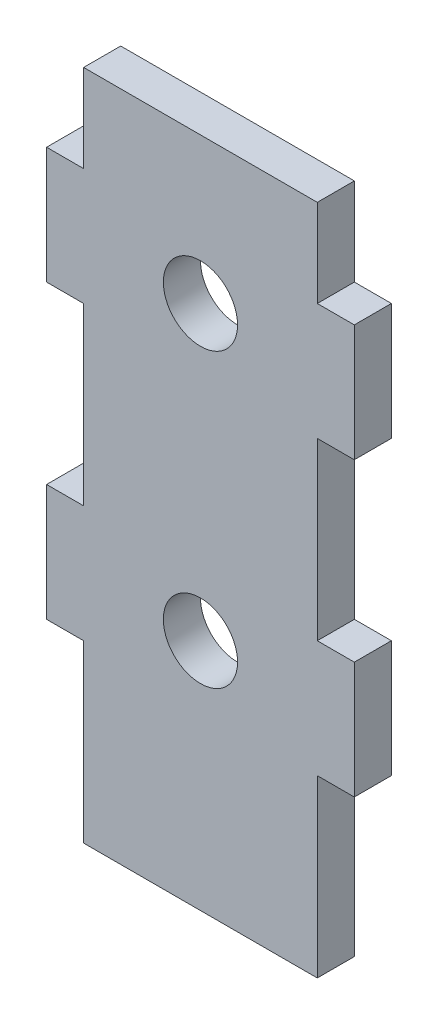
ISO-10303-21;
HEADER;
FILE_DESCRIPTION(('STEP AP214'),'2;1');
FILE_NAME('part.step','',(''),(''),'','','');
FILE_SCHEMA(('AUTOMOTIVE_DESIGN { 1 0 10303 214 1 1 1 1 }'));
ENDSEC;
DATA;
#1=APPLICATION_CONTEXT('core data for automotive mechanical design processes');
#2=APPLICATION_PROTOCOL_DEFINITION('international standard','automotive_design',2000,#1);
#3=PRODUCT_CONTEXT('',#1,'mechanical');
#4=PRODUCT('Part','Part','',(#3));
#5=PRODUCT_RELATED_PRODUCT_CATEGORY('part','',(#4));
#6=PRODUCT_DEFINITION_FORMATION('','',#4);
#7=PRODUCT_DEFINITION_CONTEXT('part definition',#1,'design');
#8=PRODUCT_DEFINITION('design','',#6,#7);
#9=PRODUCT_DEFINITION_SHAPE('','',#8);
#10=(LENGTH_UNIT() NAMED_UNIT(*) SI_UNIT(.MILLI.,.METRE.));
#11=(NAMED_UNIT(*) PLANE_ANGLE_UNIT() SI_UNIT($,.RADIAN.));
#12=(NAMED_UNIT(*) SI_UNIT($,.STERADIAN.) SOLID_ANGLE_UNIT());
#13=UNCERTAINTY_MEASURE_WITH_UNIT(LENGTH_MEASURE(1.E-05),#10,'distance_accuracy_value','');
#14=(GEOMETRIC_REPRESENTATION_CONTEXT(3) GLOBAL_UNCERTAINTY_ASSIGNED_CONTEXT((#13)) GLOBAL_UNIT_ASSIGNED_CONTEXT((#10,
#11,#12)) REPRESENTATION_CONTEXT('',''));
#15=CARTESIAN_POINT('',(0.,0.,0.));
#16=DIRECTION('',(0.,0.,1.));
#17=DIRECTION('',(1.,0.,0.));
#18=AXIS2_PLACEMENT_3D('',#15,#16,#17);
#19=CARTESIAN_POINT('',(20.,0.,6.35));
#20=DIRECTION('',(-1.,0.,0.));
#21=DIRECTION('',(0.,-1.,0.));
#22=AXIS2_PLACEMENT_3D('',#19,#20,#21);
#23=PLANE('',#22);
#24=DIRECTION('',(0.,1.,0.));
#25=VECTOR('',#24,1.);
#26=CARTESIAN_POINT('',(20.,0.,0.));
#27=LINE('',#26,#25);
#28=CARTESIAN_POINT('',(20.,0.,0.));
#29=VERTEX_POINT('',#28);
#30=CARTESIAN_POINT('',(20.,30.,0.));
#31=VERTEX_POINT('',#30);
#32=EDGE_CURVE('E214',#29,#31,#27,.T.);
#33=ORIENTED_EDGE('',*,*,#32,.T.);
#34=DIRECTION('',(0.,0.,-1.));
#35=VECTOR('',#34,1.);
#36=CARTESIAN_POINT('',(20.,30.,6.35));
#37=LINE('',#36,#35);
#38=CARTESIAN_POINT('',(20.,30.,6.35));
#39=VERTEX_POINT('',#38);
#40=EDGE_CURVE('E13',#39,#31,#37,.T.);
#41=ORIENTED_EDGE('',*,*,#40,.F.);
#42=DIRECTION('',(0.,1.,0.));
#43=VECTOR('',#42,1.);
#44=CARTESIAN_POINT('',(20.,0.,6.35));
#45=LINE('',#44,#43);
#46=CARTESIAN_POINT('',(20.,0.,6.35));
#47=VERTEX_POINT('',#46);
#48=EDGE_CURVE('E253',#47,#39,#45,.T.);
#49=ORIENTED_EDGE('',*,*,#48,.F.);
#50=DIRECTION('',(0.,0.,-1.));
#51=VECTOR('',#50,1.);
#52=CARTESIAN_POINT('',(20.,0.,6.35));
#53=LINE('',#52,#51);
#54=EDGE_CURVE('E210',#47,#29,#53,.T.);
#55=ORIENTED_EDGE('',*,*,#54,.T.);
#56=EDGE_LOOP('',(#33,#41,#49,#55));
#57=FACE_BOUND('',#56,.T.);
#58=ADVANCED_FACE('F46',(#57),#23,.F.);
#59=CARTESIAN_POINT('',(20.,30.,6.35));
#60=DIRECTION('',(0.,1.,0.));
#61=DIRECTION('',(-1.,0.,0.));
#62=AXIS2_PLACEMENT_3D('',#59,#60,#61);
#63=PLANE('',#62);
#64=DIRECTION('',(1.,0.,0.));
#65=VECTOR('',#64,1.);
#66=CARTESIAN_POINT('',(20.,30.,0.));
#67=LINE('',#66,#65);
#68=CARTESIAN_POINT('',(26.34,30.,0.));
#69=VERTEX_POINT('',#68);
#70=EDGE_CURVE('E217',#31,#69,#67,.T.);
#71=ORIENTED_EDGE('',*,*,#70,.T.);
#72=DIRECTION('',(0.,0.,-1.));
#73=VECTOR('',#72,1.);
#74=CARTESIAN_POINT('',(26.34,30.,6.35));
#75=LINE('',#74,#73);
#76=CARTESIAN_POINT('',(26.34,30.,6.35));
#77=VERTEX_POINT('',#76);
#78=EDGE_CURVE('E54',#77,#69,#75,.T.);
#79=ORIENTED_EDGE('',*,*,#78,.F.);
#80=DIRECTION('',(1.,0.,0.));
#81=VECTOR('',#80,1.);
#82=CARTESIAN_POINT('',(20.,30.,6.35));
#83=LINE('',#82,#81);
#84=EDGE_CURVE('E141',#39,#77,#83,.T.);
#85=ORIENTED_EDGE('',*,*,#84,.F.);
#86=ORIENTED_EDGE('',*,*,#40,.T.);
#87=EDGE_LOOP('',(#71,#79,#85,#86));
#88=FACE_BOUND('',#87,.T.);
#89=ADVANCED_FACE('F372',(#88),#63,.F.);
#90=CARTESIAN_POINT('',(26.34,30.,6.35));
#91=DIRECTION('',(-1.,0.,0.));
#92=DIRECTION('',(0.,0.,1.));
#93=AXIS2_PLACEMENT_3D('',#90,#91,#92);
#94=PLANE('',#93);
#95=DIRECTION('',(0.,1.,0.));
#96=VECTOR('',#95,1.);
#97=CARTESIAN_POINT('',(26.34,30.,0.));
#98=LINE('',#97,#96);
#99=CARTESIAN_POINT('',(26.34,50.,0.));
#100=VERTEX_POINT('',#99);
#101=EDGE_CURVE('E220',#69,#100,#98,.T.);
#102=ORIENTED_EDGE('',*,*,#101,.T.);
#103=DIRECTION('',(0.,0.,-1.));
#104=VECTOR('',#103,1.);
#105=CARTESIAN_POINT('',(26.34,50.,6.35));
#106=LINE('',#105,#104);
#107=CARTESIAN_POINT('',(26.34,50.,6.35));
#108=VERTEX_POINT('',#107);
#109=EDGE_CURVE('E296',#108,#100,#106,.T.);
#110=ORIENTED_EDGE('',*,*,#109,.F.);
#111=DIRECTION('',(0.,1.,0.));
#112=VECTOR('',#111,1.);
#113=CARTESIAN_POINT('',(26.34,30.,6.35));
#114=LINE('',#113,#112);
#115=EDGE_CURVE('E304',#77,#108,#114,.T.);
#116=ORIENTED_EDGE('',*,*,#115,.F.);
#117=ORIENTED_EDGE('',*,*,#78,.T.);
#118=EDGE_LOOP('',(#102,#110,#116,#117));
#119=FACE_BOUND('',#118,.T.);
#120=ADVANCED_FACE('F302',(#119),#94,.F.);
#121=CARTESIAN_POINT('',(26.34,50.,6.35));
#122=DIRECTION('',(0.,-1.,0.));
#123=DIRECTION('',(0.,0.,-1.));
#124=AXIS2_PLACEMENT_3D('',#121,#122,#123);
#125=PLANE('',#124);
#126=DIRECTION('',(-1.,0.,0.));
#127=VECTOR('',#126,1.);
#128=CARTESIAN_POINT('',(26.34,50.,0.));
#129=LINE('',#128,#127);
#130=CARTESIAN_POINT('',(20.,50.,0.));
#131=VERTEX_POINT('',#130);
#132=EDGE_CURVE('E222',#100,#131,#129,.T.);
#133=ORIENTED_EDGE('',*,*,#132,.T.);
#134=DIRECTION('',(0.,0.,-1.));
#135=VECTOR('',#134,1.);
#136=CARTESIAN_POINT('',(20.,50.,6.35));
#137=LINE('',#136,#135);
#138=CARTESIAN_POINT('',(20.,50.,6.35));
#139=VERTEX_POINT('',#138);
#140=EDGE_CURVE('E293',#139,#131,#137,.T.);
#141=ORIENTED_EDGE('',*,*,#140,.F.);
#142=DIRECTION('',(-1.,0.,0.));
#143=VECTOR('',#142,1.);
#144=CARTESIAN_POINT('',(26.34,50.,6.35));
#145=LINE('',#144,#143);
#146=EDGE_CURVE('E322',#108,#139,#145,.T.);
#147=ORIENTED_EDGE('',*,*,#146,.F.);
#148=ORIENTED_EDGE('',*,*,#109,.T.);
#149=EDGE_LOOP('',(#133,#141,#147,#148));
#150=FACE_BOUND('',#149,.T.);
#151=ADVANCED_FACE('F313',(#150),#125,.F.);
#152=CARTESIAN_POINT('',(20.,50.,6.35));
#153=DIRECTION('',(-1.,0.,0.));
#154=DIRECTION('',(0.,-1.,0.));
#155=AXIS2_PLACEMENT_3D('',#152,#153,#154);
#156=PLANE('',#155);
#157=DIRECTION('',(0.,1.,0.));
#158=VECTOR('',#157,1.);
#159=CARTESIAN_POINT('',(20.,50.,0.));
#160=LINE('',#159,#158);
#161=CARTESIAN_POINT('',(20.,80.,0.));
#162=VERTEX_POINT('',#161);
#163=EDGE_CURVE('E224',#131,#162,#160,.T.);
#164=ORIENTED_EDGE('',*,*,#163,.T.);
#165=DIRECTION('',(0.,0.,-1.));
#166=VECTOR('',#165,1.);
#167=CARTESIAN_POINT('',(20.,80.,6.35));
#168=LINE('',#167,#166);
#169=CARTESIAN_POINT('',(20.,80.,6.35));
#170=VERTEX_POINT('',#169);
#171=EDGE_CURVE('E290',#170,#162,#168,.T.);
#172=ORIENTED_EDGE('',*,*,#171,.F.);
#173=DIRECTION('',(0.,1.,0.));
#174=VECTOR('',#173,1.);
#175=CARTESIAN_POINT('',(20.,50.,6.35));
#176=LINE('',#175,#174);
#177=EDGE_CURVE('E319',#139,#170,#176,.T.);
#178=ORIENTED_EDGE('',*,*,#177,.F.);
#179=ORIENTED_EDGE('',*,*,#140,.T.);
#180=EDGE_LOOP('',(#164,#172,#178,#179));
#181=FACE_BOUND('',#180,.T.);
#182=ADVANCED_FACE('F317',(#181),#156,.F.);
#183=CARTESIAN_POINT('',(20.,80.,6.35));
#184=DIRECTION('',(0.,1.,0.));
#185=DIRECTION('',(0.,0.,1.));
#186=AXIS2_PLACEMENT_3D('',#183,#184,#185);
#187=PLANE('',#186);
#188=DIRECTION('',(1.,0.,0.));
#189=VECTOR('',#188,1.);
#190=CARTESIAN_POINT('',(20.,80.,0.));
#191=LINE('',#190,#189);
#192=CARTESIAN_POINT('',(26.34,80.,0.));
#193=VERTEX_POINT('',#192);
#194=EDGE_CURVE('E226',#162,#193,#191,.T.);
#195=ORIENTED_EDGE('',*,*,#194,.T.);
#196=DIRECTION('',(0.,0.,-1.));
#197=VECTOR('',#196,1.);
#198=CARTESIAN_POINT('',(26.34,80.,6.35));
#199=LINE('',#198,#197);
#200=CARTESIAN_POINT('',(26.34,80.,6.35));
#201=VERTEX_POINT('',#200);
#202=EDGE_CURVE('E287',#201,#193,#199,.T.);
#203=ORIENTED_EDGE('',*,*,#202,.F.);
#204=DIRECTION('',(1.,0.,0.));
#205=VECTOR('',#204,1.);
#206=CARTESIAN_POINT('',(20.,80.,6.35));
#207=LINE('',#206,#205);
#208=EDGE_CURVE('E321',#170,#201,#207,.T.);
#209=ORIENTED_EDGE('',*,*,#208,.F.);
#210=ORIENTED_EDGE('',*,*,#171,.T.);
#211=EDGE_LOOP('',(#195,#203,#209,#210));
#212=FACE_BOUND('',#211,.T.);
#213=ADVANCED_FACE('F385',(#212),#187,.F.);
#214=CARTESIAN_POINT('',(26.34,80.,6.35));
#215=DIRECTION('',(-1.,0.,0.));
#216=DIRECTION('',(0.,-1.,0.));
#217=AXIS2_PLACEMENT_3D('',#214,#215,#216);
#218=PLANE('',#217);
#219=DIRECTION('',(0.,1.,0.));
#220=VECTOR('',#219,1.);
#221=CARTESIAN_POINT('',(26.34,80.,0.));
#222=LINE('',#221,#220);
#223=CARTESIAN_POINT('',(26.34,100.,0.));
#224=VERTEX_POINT('',#223);
#225=EDGE_CURVE('E228',#193,#224,#222,.T.);
#226=ORIENTED_EDGE('',*,*,#225,.T.);
#227=DIRECTION('',(0.,0.,-1.));
#228=VECTOR('',#227,1.);
#229=CARTESIAN_POINT('',(26.34,100.,6.35));
#230=LINE('',#229,#228);
#231=CARTESIAN_POINT('',(26.34,100.,6.35));
#232=VERTEX_POINT('',#231);
#233=EDGE_CURVE('E284',#232,#224,#230,.T.);
#234=ORIENTED_EDGE('',*,*,#233,.F.);
#235=DIRECTION('',(0.,1.,0.));
#236=VECTOR('',#235,1.);
#237=CARTESIAN_POINT('',(26.34,80.,6.35));
#238=LINE('',#237,#236);
#239=EDGE_CURVE('E324',#201,#232,#238,.T.);
#240=ORIENTED_EDGE('',*,*,#239,.F.);
#241=ORIENTED_EDGE('',*,*,#202,.T.);
#242=EDGE_LOOP('',(#226,#234,#240,#241));
#243=FACE_BOUND('',#242,.T.);
#244=ADVANCED_FACE('F388',(#243),#218,.F.);
#245=CARTESIAN_POINT('',(26.34,100.,6.35));
#246=DIRECTION('',(0.,-1.,0.));
#247=DIRECTION('',(0.,0.,-1.));
#248=AXIS2_PLACEMENT_3D('',#245,#246,#247);
#249=PLANE('',#248);
#250=DIRECTION('',(-1.,0.,0.));
#251=VECTOR('',#250,1.);
#252=CARTESIAN_POINT('',(26.34,100.,0.));
#253=LINE('',#252,#251);
#254=CARTESIAN_POINT('',(20.,100.,0.));
#255=VERTEX_POINT('',#254);
#256=EDGE_CURVE('E230',#224,#255,#253,.T.);
#257=ORIENTED_EDGE('',*,*,#256,.T.);
#258=DIRECTION('',(0.,0.,-1.));
#259=VECTOR('',#258,1.);
#260=CARTESIAN_POINT('',(20.,100.,6.35));
#261=LINE('',#260,#259);
#262=CARTESIAN_POINT('',(20.,100.,6.35));
#263=VERTEX_POINT('',#262);
#264=EDGE_CURVE('E281',#263,#255,#261,.T.);
#265=ORIENTED_EDGE('',*,*,#264,.F.);
#266=DIRECTION('',(-1.,0.,0.));
#267=VECTOR('',#266,1.);
#268=CARTESIAN_POINT('',(26.34,100.,6.35));
#269=LINE('',#268,#267);
#270=EDGE_CURVE('E330',#232,#263,#269,.T.);
#271=ORIENTED_EDGE('',*,*,#270,.F.);
#272=ORIENTED_EDGE('',*,*,#233,.T.);
#273=EDGE_LOOP('',(#257,#265,#271,#272));
#274=FACE_BOUND('',#273,.T.);
#275=ADVANCED_FACE('F392',(#274),#249,.F.);
#276=CARTESIAN_POINT('',(20.,100.,6.35));
#277=DIRECTION('',(-1.,0.,0.));
#278=DIRECTION('',(0.,-1.,0.));
#279=AXIS2_PLACEMENT_3D('',#276,#277,#278);
#280=PLANE('',#279);
#281=DIRECTION('',(0.,1.,0.));
#282=VECTOR('',#281,1.);
#283=CARTESIAN_POINT('',(20.,100.,0.));
#284=LINE('',#283,#282);
#285=CARTESIAN_POINT('',(20.,115.,0.));
#286=VERTEX_POINT('',#285);
#287=EDGE_CURVE('E232',#255,#286,#284,.T.);
#288=ORIENTED_EDGE('',*,*,#287,.T.);
#289=DIRECTION('',(0.,0.,-1.));
#290=VECTOR('',#289,1.);
#291=CARTESIAN_POINT('',(20.,115.,6.35));
#292=LINE('',#291,#290);
#293=CARTESIAN_POINT('',(20.,115.,6.35));
#294=VERTEX_POINT('',#293);
#295=EDGE_CURVE('E278',#294,#286,#292,.T.);
#296=ORIENTED_EDGE('',*,*,#295,.F.);
#297=DIRECTION('',(0.,1.,0.));
#298=VECTOR('',#297,1.);
#299=CARTESIAN_POINT('',(20.,100.,6.35));
#300=LINE('',#299,#298);
#301=EDGE_CURVE('E332',#263,#294,#300,.T.);
#302=ORIENTED_EDGE('',*,*,#301,.F.);
#303=ORIENTED_EDGE('',*,*,#264,.T.);
#304=EDGE_LOOP('',(#288,#296,#302,#303));
#305=FACE_BOUND('',#304,.T.);
#306=ADVANCED_FACE('F396',(#305),#280,.F.);
#307=CARTESIAN_POINT('',(20.,115.,6.35));
#308=DIRECTION('',(0.,-1.,0.));
#309=DIRECTION('',(0.,0.,-1.));
#310=AXIS2_PLACEMENT_3D('',#307,#308,#309);
#311=PLANE('',#310);
#312=DIRECTION('',(-1.,0.,0.));
#313=VECTOR('',#312,1.);
#314=CARTESIAN_POINT('',(20.,115.,0.));
#315=LINE('',#314,#313);
#316=CARTESIAN_POINT('',(-20.,115.,0.));
#317=VERTEX_POINT('',#316);
#318=EDGE_CURVE('E234',#286,#317,#315,.T.);
#319=ORIENTED_EDGE('',*,*,#318,.T.);
#320=DIRECTION('',(0.,0.,-1.));
#321=VECTOR('',#320,1.);
#322=CARTESIAN_POINT('',(-20.,115.,6.35));
#323=LINE('',#322,#321);
#324=CARTESIAN_POINT('',(-20.,115.,6.35));
#325=VERTEX_POINT('',#324);
#326=EDGE_CURVE('E275',#325,#317,#323,.T.);
#327=ORIENTED_EDGE('',*,*,#326,.F.);
#328=DIRECTION('',(-1.,0.,0.));
#329=VECTOR('',#328,1.);
#330=CARTESIAN_POINT('',(20.,115.,6.35));
#331=LINE('',#330,#329);
#332=EDGE_CURVE('E334',#294,#325,#331,.T.);
#333=ORIENTED_EDGE('',*,*,#332,.F.);
#334=ORIENTED_EDGE('',*,*,#295,.T.);
#335=EDGE_LOOP('',(#319,#327,#333,#334));
#336=FACE_BOUND('',#335,.T.);
#337=ADVANCED_FACE('F400',(#336),#311,.F.);
#338=CARTESIAN_POINT('',(-20.,100.,6.35));
#339=DIRECTION('',(1.,0.,0.));
#340=DIRECTION('',(0.,1.,0.));
#341=AXIS2_PLACEMENT_3D('',#338,#339,#340);
#342=PLANE('',#341);
#343=DIRECTION('',(0.,-1.,0.));
#344=VECTOR('',#343,1.);
#345=CARTESIAN_POINT('',(-20.,100.,0.));
#346=LINE('',#345,#344);
#347=CARTESIAN_POINT('',(-20.,100.,0.));
#348=VERTEX_POINT('',#347);
#349=EDGE_CURVE('E236',#317,#348,#346,.T.);
#350=ORIENTED_EDGE('',*,*,#349,.T.);
#351=DIRECTION('',(0.,0.,-1.));
#352=VECTOR('',#351,1.);
#353=CARTESIAN_POINT('',(-20.,100.,6.35));
#354=LINE('',#353,#352);
#355=CARTESIAN_POINT('',(-20.,100.,6.35));
#356=VERTEX_POINT('',#355);
#357=EDGE_CURVE('E272',#356,#348,#354,.T.);
#358=ORIENTED_EDGE('',*,*,#357,.F.);
#359=DIRECTION('',(0.,-1.,0.));
#360=VECTOR('',#359,1.);
#361=CARTESIAN_POINT('',(-20.,100.,6.35));
#362=LINE('',#361,#360);
#363=EDGE_CURVE('E336',#325,#356,#362,.T.);
#364=ORIENTED_EDGE('',*,*,#363,.F.);
#365=ORIENTED_EDGE('',*,*,#326,.T.);
#366=EDGE_LOOP('',(#350,#358,#364,#365));
#367=FACE_BOUND('',#366,.T.);
#368=ADVANCED_FACE('F404',(#367),#342,.F.);
#369=CARTESIAN_POINT('',(-26.34,100.,6.35));
#370=DIRECTION('',(0.,-1.,0.));
#371=DIRECTION('',(0.,0.,-1.));
#372=AXIS2_PLACEMENT_3D('',#369,#370,#371);
#373=PLANE('',#372);
#374=DIRECTION('',(-1.,0.,0.));
#375=VECTOR('',#374,1.);
#376=CARTESIAN_POINT('',(-26.34,100.,0.));
#377=LINE('',#376,#375);
#378=CARTESIAN_POINT('',(-26.34,100.,0.));
#379=VERTEX_POINT('',#378);
#380=EDGE_CURVE('E238',#348,#379,#377,.T.);
#381=ORIENTED_EDGE('',*,*,#380,.T.);
#382=DIRECTION('',(0.,0.,-1.));
#383=VECTOR('',#382,1.);
#384=CARTESIAN_POINT('',(-26.34,100.,6.35));
#385=LINE('',#384,#383);
#386=CARTESIAN_POINT('',(-26.34,100.,6.35));
#387=VERTEX_POINT('',#386);
#388=EDGE_CURVE('E269',#387,#379,#385,.T.);
#389=ORIENTED_EDGE('',*,*,#388,.F.);
#390=DIRECTION('',(-1.,0.,0.));
#391=VECTOR('',#390,1.);
#392=CARTESIAN_POINT('',(-26.34,100.,6.35));
#393=LINE('',#392,#391);
#394=EDGE_CURVE('E338',#356,#387,#393,.T.);
#395=ORIENTED_EDGE('',*,*,#394,.F.);
#396=ORIENTED_EDGE('',*,*,#357,.T.);
#397=EDGE_LOOP('',(#381,#389,#395,#396));
#398=FACE_BOUND('',#397,.T.);
#399=ADVANCED_FACE('F408',(#398),#373,.F.);
#400=CARTESIAN_POINT('',(-26.34,80.,6.35));
#401=DIRECTION('',(1.,0.,0.));
#402=DIRECTION('',(0.,1.,0.));
#403=AXIS2_PLACEMENT_3D('',#400,#401,#402);
#404=PLANE('',#403);
#405=DIRECTION('',(0.,-1.,0.));
#406=VECTOR('',#405,1.);
#407=CARTESIAN_POINT('',(-26.34,80.,0.));
#408=LINE('',#407,#406);
#409=CARTESIAN_POINT('',(-26.34,80.,0.));
#410=VERTEX_POINT('',#409);
#411=EDGE_CURVE('E240',#379,#410,#408,.T.);
#412=ORIENTED_EDGE('',*,*,#411,.T.);
#413=DIRECTION('',(0.,0.,-1.));
#414=VECTOR('',#413,1.);
#415=CARTESIAN_POINT('',(-26.34,80.,6.35));
#416=LINE('',#415,#414);
#417=CARTESIAN_POINT('',(-26.34,80.,6.35));
#418=VERTEX_POINT('',#417);
#419=EDGE_CURVE('E266',#418,#410,#416,.T.);
#420=ORIENTED_EDGE('',*,*,#419,.F.);
#421=DIRECTION('',(0.,-1.,0.));
#422=VECTOR('',#421,1.);
#423=CARTESIAN_POINT('',(-26.34,80.,6.35));
#424=LINE('',#423,#422);
#425=EDGE_CURVE('E340',#387,#418,#424,.T.);
#426=ORIENTED_EDGE('',*,*,#425,.F.);
#427=ORIENTED_EDGE('',*,*,#388,.T.);
#428=EDGE_LOOP('',(#412,#420,#426,#427));
#429=FACE_BOUND('',#428,.T.);
#430=ADVANCED_FACE('F412',(#429),#404,.F.);
#431=CARTESIAN_POINT('',(-20.,80.,6.35));
#432=DIRECTION('',(0.,1.,0.));
#433=DIRECTION('',(0.,0.,1.));
#434=AXIS2_PLACEMENT_3D('',#431,#432,#433);
#435=PLANE('',#434);
#436=DIRECTION('',(1.,0.,0.));
#437=VECTOR('',#436,1.);
#438=CARTESIAN_POINT('',(-20.,80.,0.));
#439=LINE('',#438,#437);
#440=CARTESIAN_POINT('',(-20.,80.,0.));
#441=VERTEX_POINT('',#440);
#442=EDGE_CURVE('E242',#410,#441,#439,.T.);
#443=ORIENTED_EDGE('',*,*,#442,.T.);
#444=DIRECTION('',(0.,0.,-1.));
#445=VECTOR('',#444,1.);
#446=CARTESIAN_POINT('',(-20.,80.,6.35));
#447=LINE('',#446,#445);
#448=CARTESIAN_POINT('',(-20.,80.,6.35));
#449=VERTEX_POINT('',#448);
#450=EDGE_CURVE('E263',#449,#441,#447,.T.);
#451=ORIENTED_EDGE('',*,*,#450,.F.);
#452=DIRECTION('',(1.,0.,0.));
#453=VECTOR('',#452,1.);
#454=CARTESIAN_POINT('',(-20.,80.,6.35));
#455=LINE('',#454,#453);
#456=EDGE_CURVE('E342',#418,#449,#455,.T.);
#457=ORIENTED_EDGE('',*,*,#456,.F.);
#458=ORIENTED_EDGE('',*,*,#419,.T.);
#459=EDGE_LOOP('',(#443,#451,#457,#458));
#460=FACE_BOUND('',#459,.T.);
#461=ADVANCED_FACE('F416',(#460),#435,.F.);
#462=CARTESIAN_POINT('',(-20.,50.,6.35));
#463=DIRECTION('',(1.,0.,0.));
#464=DIRECTION('',(0.,0.,-1.));
#465=AXIS2_PLACEMENT_3D('',#462,#463,#464);
#466=PLANE('',#465);
#467=DIRECTION('',(0.,-1.,0.));
#468=VECTOR('',#467,1.);
#469=CARTESIAN_POINT('',(-20.,50.,0.));
#470=LINE('',#469,#468);
#471=CARTESIAN_POINT('',(-20.,50.,0.));
#472=VERTEX_POINT('',#471);
#473=EDGE_CURVE('E244',#441,#472,#470,.T.);
#474=ORIENTED_EDGE('',*,*,#473,.T.);
#475=DIRECTION('',(0.,0.,-1.));
#476=VECTOR('',#475,1.);
#477=CARTESIAN_POINT('',(-20.,50.,6.35));
#478=LINE('',#477,#476);
#479=CARTESIAN_POINT('',(-20.,50.,6.35));
#480=VERTEX_POINT('',#479);
#481=EDGE_CURVE('E260',#480,#472,#478,.T.);
#482=ORIENTED_EDGE('',*,*,#481,.F.);
#483=DIRECTION('',(0.,-1.,0.));
#484=VECTOR('',#483,1.);
#485=CARTESIAN_POINT('',(-20.,50.,6.35));
#486=LINE('',#485,#484);
#487=EDGE_CURVE('E344',#449,#480,#486,.T.);
#488=ORIENTED_EDGE('',*,*,#487,.F.);
#489=ORIENTED_EDGE('',*,*,#450,.T.);
#490=EDGE_LOOP('',(#474,#482,#488,#489));
#491=FACE_BOUND('',#490,.T.);
#492=ADVANCED_FACE('F420',(#491),#466,.F.);
#493=CARTESIAN_POINT('',(-26.34,50.,6.35));
#494=DIRECTION('',(0.,-1.,0.));
#495=DIRECTION('',(0.,0.,-1.));
#496=AXIS2_PLACEMENT_3D('',#493,#494,#495);
#497=PLANE('',#496);
#498=DIRECTION('',(-1.,0.,0.));
#499=VECTOR('',#498,1.);
#500=CARTESIAN_POINT('',(-26.34,50.,0.));
#501=LINE('',#500,#499);
#502=CARTESIAN_POINT('',(-26.34,50.,0.));
#503=VERTEX_POINT('',#502);
#504=EDGE_CURVE('E246',#472,#503,#501,.T.);
#505=ORIENTED_EDGE('',*,*,#504,.T.);
#506=DIRECTION('',(0.,0.,-1.));
#507=VECTOR('',#506,1.);
#508=CARTESIAN_POINT('',(-26.34,50.,6.35));
#509=LINE('',#508,#507);
#510=CARTESIAN_POINT('',(-26.34,50.,6.35));
#511=VERTEX_POINT('',#510);
#512=EDGE_CURVE('E257',#511,#503,#509,.T.);
#513=ORIENTED_EDGE('',*,*,#512,.F.);
#514=DIRECTION('',(-1.,0.,0.));
#515=VECTOR('',#514,1.);
#516=CARTESIAN_POINT('',(-26.34,50.,6.35));
#517=LINE('',#516,#515);
#518=EDGE_CURVE('E346',#480,#511,#517,.T.);
#519=ORIENTED_EDGE('',*,*,#518,.F.);
#520=ORIENTED_EDGE('',*,*,#481,.T.);
#521=EDGE_LOOP('',(#505,#513,#519,#520));
#522=FACE_BOUND('',#521,.T.);
#523=ADVANCED_FACE('F352',(#522),#497,.F.);
#524=CARTESIAN_POINT('',(-26.34,30.,6.35));
#525=DIRECTION('',(1.,0.,0.));
#526=DIRECTION('',(0.,1.,0.));
#527=AXIS2_PLACEMENT_3D('',#524,#525,#526);
#528=PLANE('',#527);
#529=DIRECTION('',(0.,-1.,0.));
#530=VECTOR('',#529,1.);
#531=CARTESIAN_POINT('',(-26.34,30.,0.));
#532=LINE('',#531,#530);
#533=CARTESIAN_POINT('',(-26.34,30.,0.));
#534=VERTEX_POINT('',#533);
#535=EDGE_CURVE('E248',#503,#534,#532,.T.);
#536=ORIENTED_EDGE('',*,*,#535,.T.);
#537=DIRECTION('',(0.,0.,-1.));
#538=VECTOR('',#537,1.);
#539=CARTESIAN_POINT('',(-26.34,30.,6.35));
#540=LINE('',#539,#538);
#541=CARTESIAN_POINT('',(-26.34,30.,6.35));
#542=VERTEX_POINT('',#541);
#543=EDGE_CURVE('E205',#542,#534,#540,.T.);
#544=ORIENTED_EDGE('',*,*,#543,.F.);
#545=DIRECTION('',(0.,-1.,0.));
#546=VECTOR('',#545,1.);
#547=CARTESIAN_POINT('',(-26.34,30.,6.35));
#548=LINE('',#547,#546);
#549=EDGE_CURVE('E196',#511,#542,#548,.T.);
#550=ORIENTED_EDGE('',*,*,#549,.F.);
#551=ORIENTED_EDGE('',*,*,#512,.T.);
#552=EDGE_LOOP('',(#536,#544,#550,#551));
#553=FACE_BOUND('',#552,.T.);
#554=ADVANCED_FACE('F356',(#553),#528,.F.);
#555=CARTESIAN_POINT('',(-20.,30.,6.35));
#556=DIRECTION('',(0.,1.,0.));
#557=DIRECTION('',(-1.,0.,0.));
#558=AXIS2_PLACEMENT_3D('',#555,#556,#557);
#559=PLANE('',#558);
#560=DIRECTION('',(1.,0.,0.));
#561=VECTOR('',#560,1.);
#562=CARTESIAN_POINT('',(-20.,30.,0.));
#563=LINE('',#562,#561);
#564=CARTESIAN_POINT('',(-20.,30.,0.));
#565=VERTEX_POINT('',#564);
#566=EDGE_CURVE('E204',#534,#565,#563,.T.);
#567=ORIENTED_EDGE('',*,*,#566,.T.);
#568=DIRECTION('',(0.,0.,-1.));
#569=VECTOR('',#568,1.);
#570=CARTESIAN_POINT('',(-20.,30.,6.35));
#571=LINE('',#570,#569);
#572=CARTESIAN_POINT('',(-20.,30.,6.35));
#573=VERTEX_POINT('',#572);
#574=EDGE_CURVE('E201',#573,#565,#571,.T.);
#575=ORIENTED_EDGE('',*,*,#574,.F.);
#576=DIRECTION('',(1.,0.,0.));
#577=VECTOR('',#576,1.);
#578=CARTESIAN_POINT('',(-20.,30.,6.35));
#579=LINE('',#578,#577);
#580=EDGE_CURVE('E190',#542,#573,#579,.T.);
#581=ORIENTED_EDGE('',*,*,#580,.F.);
#582=ORIENTED_EDGE('',*,*,#543,.T.);
#583=EDGE_LOOP('',(#567,#575,#581,#582));
#584=FACE_BOUND('',#583,.T.);
#585=ADVANCED_FACE('F202',(#584),#559,.F.);
#586=CARTESIAN_POINT('',(-20.,0.,6.35));
#587=DIRECTION('',(1.,0.,0.));
#588=DIRECTION('',(0.,1.,0.));
#589=AXIS2_PLACEMENT_3D('',#586,#587,#588);
#590=PLANE('',#589);
#591=DIRECTION('',(0.,-1.,0.));
#592=VECTOR('',#591,1.);
#593=CARTESIAN_POINT('',(-20.,0.,0.));
#594=LINE('',#593,#592);
#595=CARTESIAN_POINT('',(-20.,0.,0.));
#596=VERTEX_POINT('',#595);
#597=EDGE_CURVE('E127',#565,#596,#594,.T.);
#598=ORIENTED_EDGE('',*,*,#597,.T.);
#599=DIRECTION('',(0.,0.,-1.));
#600=VECTOR('',#599,1.);
#601=CARTESIAN_POINT('',(-20.,0.,6.35));
#602=LINE('',#601,#600);
#603=CARTESIAN_POINT('',(-20.,0.,6.35));
#604=VERTEX_POINT('',#603);
#605=EDGE_CURVE('E206',#604,#596,#602,.T.);
#606=ORIENTED_EDGE('',*,*,#605,.F.);
#607=DIRECTION('',(0.,-1.,0.));
#608=VECTOR('',#607,1.);
#609=CARTESIAN_POINT('',(-20.,0.,6.35));
#610=LINE('',#609,#608);
#611=EDGE_CURVE('E194',#573,#604,#610,.T.);
#612=ORIENTED_EDGE('',*,*,#611,.F.);
#613=ORIENTED_EDGE('',*,*,#574,.T.);
#614=EDGE_LOOP('',(#598,#606,#612,#613));
#615=FACE_BOUND('',#614,.T.);
#616=ADVANCED_FACE('F208',(#615),#590,.F.);
#617=CARTESIAN_POINT('',(-20.,0.,6.35));
#618=DIRECTION('',(0.,1.,0.));
#619=DIRECTION('',(0.,0.,1.));
#620=AXIS2_PLACEMENT_3D('',#617,#618,#619);
#621=PLANE('',#620);
#622=DIRECTION('',(1.,0.,0.));
#623=VECTOR('',#622,1.);
#624=CARTESIAN_POINT('',(-20.,0.,0.));
#625=LINE('',#624,#623);
#626=EDGE_CURVE('E133',#596,#29,#625,.T.);
#627=ORIENTED_EDGE('',*,*,#626,.T.);
#628=ORIENTED_EDGE('',*,*,#54,.F.);
#629=DIRECTION('',(1.,0.,0.));
#630=VECTOR('',#629,1.);
#631=CARTESIAN_POINT('',(-20.,0.,6.35));
#632=LINE('',#631,#630);
#633=EDGE_CURVE('E62',#604,#47,#632,.T.);
#634=ORIENTED_EDGE('',*,*,#633,.F.);
#635=ORIENTED_EDGE('',*,*,#605,.T.);
#636=EDGE_LOOP('',(#627,#628,#634,#635));
#637=FACE_BOUND('',#636,.T.);
#638=ADVANCED_FACE('F360',(#637),#621,.F.);
#639=CARTESIAN_POINT('',(0.,0.,6.35));
#640=DIRECTION('',(0.,0.,-1.));
#641=DIRECTION('',(-1.,0.,0.));
#642=AXIS2_PLACEMENT_3D('',#639,#640,#641);
#643=PLANE('',#642);
#644=CARTESIAN_POINT('',(0.,90.,6.35));
#645=DIRECTION('',(0.,0.,-1.));
#646=DIRECTION('',(-1.,0.,0.));
#647=AXIS2_PLACEMENT_3D('',#644,#645,#646);
#648=CIRCLE('',#647,6.34999999999999);
#649=CARTESIAN_POINT('',(-6.35,90.,6.35));
#650=VERTEX_POINT('',#649);
#651=EDGE_CURVE('E218',#650,#650,#648,.T.);
#652=ORIENTED_EDGE('',*,*,#651,.T.);
#653=EDGE_LOOP('',(#652));
#654=FACE_BOUND('',#653,.T.);
#655=CARTESIAN_POINT('',(0.,40.,6.35));
#656=DIRECTION('',(0.,0.,-1.));
#657=DIRECTION('',(-1.,0.,0.));
#658=AXIS2_PLACEMENT_3D('',#655,#656,#657);
#659=CIRCLE('',#658,6.35);
#660=CARTESIAN_POINT('',(-6.35000000000001,40.,6.35));
#661=VERTEX_POINT('',#660);
#662=EDGE_CURVE('E486',#661,#661,#659,.T.);
#663=ORIENTED_EDGE('',*,*,#662,.T.);
#664=EDGE_LOOP('',(#663));
#665=FACE_BOUND('',#664,.T.);
#666=ORIENTED_EDGE('',*,*,#48,.T.);
#667=ORIENTED_EDGE('',*,*,#84,.T.);
#668=ORIENTED_EDGE('',*,*,#115,.T.);
#669=ORIENTED_EDGE('',*,*,#146,.T.);
#670=ORIENTED_EDGE('',*,*,#177,.T.);
#671=ORIENTED_EDGE('',*,*,#208,.T.);
#672=ORIENTED_EDGE('',*,*,#239,.T.);
#673=ORIENTED_EDGE('',*,*,#270,.T.);
#674=ORIENTED_EDGE('',*,*,#301,.T.);
#675=ORIENTED_EDGE('',*,*,#332,.T.);
#676=ORIENTED_EDGE('',*,*,#363,.T.);
#677=ORIENTED_EDGE('',*,*,#394,.T.);
#678=ORIENTED_EDGE('',*,*,#425,.T.);
#679=ORIENTED_EDGE('',*,*,#456,.T.);
#680=ORIENTED_EDGE('',*,*,#487,.T.);
#681=ORIENTED_EDGE('',*,*,#518,.T.);
#682=ORIENTED_EDGE('',*,*,#549,.T.);
#683=ORIENTED_EDGE('',*,*,#580,.T.);
#684=ORIENTED_EDGE('',*,*,#611,.T.);
#685=ORIENTED_EDGE('',*,*,#633,.T.);
#686=EDGE_LOOP('',(#666,#667,#668,#669,#670,#671,#672,#673,#674,#675,#676,#677,#678,#679,#680,
#681,#682,#683,#684,#685));
#687=FACE_BOUND('',#686,.T.);
#688=ADVANCED_FACE('F192',(#654,#665,#687),#643,.F.);
#689=CARTESIAN_POINT('',(0.,0.,0.));
#690=DIRECTION('',(0.,0.,-1.));
#691=DIRECTION('',(-1.,0.,0.));
#692=AXIS2_PLACEMENT_3D('',#689,#690,#691);
#693=PLANE('',#692);
#694=CARTESIAN_POINT('',(0.,90.,0.));
#695=DIRECTION('',(0.,0.,1.));
#696=DIRECTION('',(1.,0.,0.));
#697=AXIS2_PLACEMENT_3D('',#694,#695,#696);
#698=CIRCLE('',#697,6.34999999999999);
#699=CARTESIAN_POINT('',(6.34999999999999,90.,0.));
#700=VERTEX_POINT('',#699);
#701=EDGE_CURVE('E483',#700,#700,#698,.T.);
#702=ORIENTED_EDGE('',*,*,#701,.T.);
#703=EDGE_LOOP('',(#702));
#704=FACE_BOUND('',#703,.T.);
#705=CARTESIAN_POINT('',(0.,40.,0.));
#706=DIRECTION('',(0.,0.,1.));
#707=DIRECTION('',(1.,0.,0.));
#708=AXIS2_PLACEMENT_3D('',#705,#706,#707);
#709=CIRCLE('',#708,6.35);
#710=CARTESIAN_POINT('',(6.35,40.,0.));
#711=VERTEX_POINT('',#710);
#712=EDGE_CURVE('E493',#711,#711,#709,.T.);
#713=ORIENTED_EDGE('',*,*,#712,.T.);
#714=EDGE_LOOP('',(#713));
#715=FACE_BOUND('',#714,.T.);
#716=ORIENTED_EDGE('',*,*,#32,.F.);
#717=ORIENTED_EDGE('',*,*,#626,.F.);
#718=ORIENTED_EDGE('',*,*,#597,.F.);
#719=ORIENTED_EDGE('',*,*,#566,.F.);
#720=ORIENTED_EDGE('',*,*,#535,.F.);
#721=ORIENTED_EDGE('',*,*,#504,.F.);
#722=ORIENTED_EDGE('',*,*,#473,.F.);
#723=ORIENTED_EDGE('',*,*,#442,.F.);
#724=ORIENTED_EDGE('',*,*,#411,.F.);
#725=ORIENTED_EDGE('',*,*,#380,.F.);
#726=ORIENTED_EDGE('',*,*,#349,.F.);
#727=ORIENTED_EDGE('',*,*,#318,.F.);
#728=ORIENTED_EDGE('',*,*,#287,.F.);
#729=ORIENTED_EDGE('',*,*,#256,.F.);
#730=ORIENTED_EDGE('',*,*,#225,.F.);
#731=ORIENTED_EDGE('',*,*,#194,.F.);
#732=ORIENTED_EDGE('',*,*,#163,.F.);
#733=ORIENTED_EDGE('',*,*,#132,.F.);
#734=ORIENTED_EDGE('',*,*,#101,.F.);
#735=ORIENTED_EDGE('',*,*,#70,.F.);
#736=EDGE_LOOP('',(#716,#717,#718,#719,#720,#721,#722,#723,#724,#725,#726,#727,#728,#729,#730,
#731,#732,#733,#734,#735));
#737=FACE_BOUND('',#736,.T.);
#738=ADVANCED_FACE('F308',(#704,#715,#737),#693,.T.);
#739=CARTESIAN_POINT('',(0.,40.,0.));
#740=DIRECTION('',(0.,0.,1.));
#741=DIRECTION('',(1.,0.,0.));
#742=AXIS2_PLACEMENT_3D('',#739,#740,#741);
#743=CYLINDRICAL_SURFACE('',#742,6.35);
#744=ORIENTED_EDGE('',*,*,#712,.F.);
#745=EDGE_LOOP('',(#744));
#746=FACE_BOUND('',#745,.T.);
#747=ORIENTED_EDGE('',*,*,#662,.F.);
#748=EDGE_LOOP('',(#747));
#749=FACE_BOUND('',#748,.T.);
#750=ADVANCED_FACE('F457',(#746,#749),#743,.F.);
#751=CARTESIAN_POINT('',(0.,90.,0.));
#752=DIRECTION('',(0.,0.,1.));
#753=DIRECTION('',(1.,0.,0.));
#754=AXIS2_PLACEMENT_3D('',#751,#752,#753);
#755=CYLINDRICAL_SURFACE('',#754,6.34999999999999);
#756=ORIENTED_EDGE('',*,*,#701,.F.);
#757=EDGE_LOOP('',(#756));
#758=FACE_BOUND('',#757,.T.);
#759=ORIENTED_EDGE('',*,*,#651,.F.);
#760=EDGE_LOOP('',(#759));
#761=FACE_BOUND('',#760,.T.);
#762=ADVANCED_FACE('F466',(#758,#761),#755,.F.);
#763=CLOSED_SHELL('',(#58,#89,#120,#151,#182,#213,#244,#275,#306,#337,#368,#399,#430,#461,#492,
#523,#554,#585,#616,#638,#688,#738,#750,#762));
#764=MANIFOLD_SOLID_BREP('B2',#763);
#765=ADVANCED_BREP_SHAPE_REPRESENTATION('',(#18,#764),#14);
#766=SHAPE_DEFINITION_REPRESENTATION(#9,#765);
ENDSEC;
END-ISO-10303-21;
